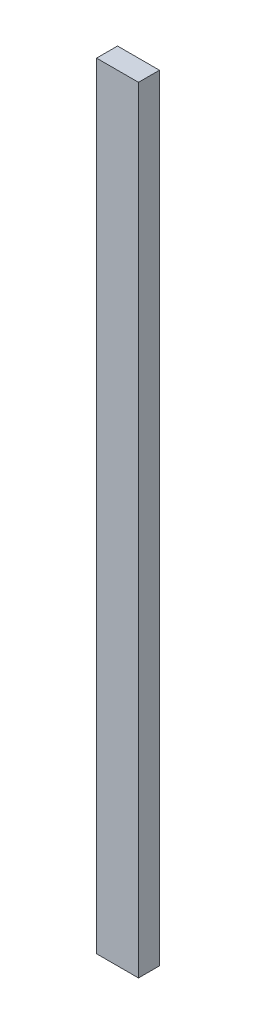
ISO-10303-21;
HEADER;
FILE_DESCRIPTION(('STEP AP214'),'2;1');
FILE_NAME('part.step','',(''),(''),'','','');
FILE_SCHEMA(('AUTOMOTIVE_DESIGN { 1 0 10303 214 1 1 1 1 }'));
ENDSEC;
DATA;
#1=APPLICATION_CONTEXT('core data for automotive mechanical design processes');
#2=APPLICATION_PROTOCOL_DEFINITION('international standard','automotive_design',2000,#1);
#3=PRODUCT_CONTEXT('',#1,'mechanical');
#4=PRODUCT('Part','Part','',(#3));
#5=PRODUCT_RELATED_PRODUCT_CATEGORY('part','',(#4));
#6=PRODUCT_DEFINITION_FORMATION('','',#4);
#7=PRODUCT_DEFINITION_CONTEXT('part definition',#1,'design');
#8=PRODUCT_DEFINITION('design','',#6,#7);
#9=PRODUCT_DEFINITION_SHAPE('','',#8);
#10=(LENGTH_UNIT() NAMED_UNIT(*) SI_UNIT(.MILLI.,.METRE.));
#11=(NAMED_UNIT(*) PLANE_ANGLE_UNIT() SI_UNIT($,.RADIAN.));
#12=(NAMED_UNIT(*) SI_UNIT($,.STERADIAN.) SOLID_ANGLE_UNIT());
#13=UNCERTAINTY_MEASURE_WITH_UNIT(LENGTH_MEASURE(1.E-05),#10,'distance_accuracy_value','');
#14=(GEOMETRIC_REPRESENTATION_CONTEXT(3) GLOBAL_UNCERTAINTY_ASSIGNED_CONTEXT((#13)) GLOBAL_UNIT_ASSIGNED_CONTEXT((#10,
#11,#12)) REPRESENTATION_CONTEXT('',''));
#15=CARTESIAN_POINT('',(0.,0.,0.));
#16=DIRECTION('',(0.,0.,1.));
#17=DIRECTION('',(1.,0.,0.));
#18=AXIS2_PLACEMENT_3D('',#15,#16,#17);
#19=CARTESIAN_POINT('',(0.,-370.,10.));
#20=DIRECTION('',(1.,0.,0.));
#21=DIRECTION('',(0.,1.,0.));
#22=AXIS2_PLACEMENT_3D('',#19,#20,#21);
#23=PLANE('',#22);
#24=DIRECTION('',(0.,-1.,0.));
#25=VECTOR('',#24,1.);
#26=CARTESIAN_POINT('',(0.,-370.,0.));
#27=LINE('',#26,#25);
#28=CARTESIAN_POINT('',(0.,0.,0.));
#29=VERTEX_POINT('',#28);
#30=CARTESIAN_POINT('',(0.,-370.,0.));
#31=VERTEX_POINT('',#30);
#32=EDGE_CURVE('E107',#29,#31,#27,.T.);
#33=ORIENTED_EDGE('',*,*,#32,.T.);
#34=DIRECTION('',(0.,0.,-1.));
#35=VECTOR('',#34,1.);
#36=CARTESIAN_POINT('',(0.,-370.,10.));
#37=LINE('',#36,#35);
#38=CARTESIAN_POINT('',(0.,-370.,10.));
#39=VERTEX_POINT('',#38);
#40=EDGE_CURVE('E11',#39,#31,#37,.T.);
#41=ORIENTED_EDGE('',*,*,#40,.F.);
#42=DIRECTION('',(0.,-1.,0.));
#43=VECTOR('',#42,1.);
#44=CARTESIAN_POINT('',(0.,-370.,10.));
#45=LINE('',#44,#43);
#46=CARTESIAN_POINT('',(0.,0.,10.));
#47=VERTEX_POINT('',#46);
#48=EDGE_CURVE('E91',#47,#39,#45,.T.);
#49=ORIENTED_EDGE('',*,*,#48,.F.);
#50=DIRECTION('',(0.,0.,-1.));
#51=VECTOR('',#50,1.);
#52=CARTESIAN_POINT('',(0.,0.,10.));
#53=LINE('',#52,#51);
#54=EDGE_CURVE('E103',#47,#29,#53,.T.);
#55=ORIENTED_EDGE('',*,*,#54,.T.);
#56=EDGE_LOOP('',(#33,#41,#49,#55));
#57=FACE_BOUND('',#56,.T.);
#58=ADVANCED_FACE('F39',(#57),#23,.F.);
#59=CARTESIAN_POINT('',(20.,-370.,10.));
#60=DIRECTION('',(0.,1.,0.));
#61=DIRECTION('',(0.,0.,1.));
#62=AXIS2_PLACEMENT_3D('',#59,#60,#61);
#63=PLANE('',#62);
#64=DIRECTION('',(1.,0.,0.));
#65=VECTOR('',#64,1.);
#66=CARTESIAN_POINT('',(20.,-370.,0.));
#67=LINE('',#66,#65);
#68=CARTESIAN_POINT('',(20.,-370.,0.));
#69=VERTEX_POINT('',#68);
#70=EDGE_CURVE('E96',#31,#69,#67,.T.);
#71=ORIENTED_EDGE('',*,*,#70,.T.);
#72=DIRECTION('',(0.,0.,-1.));
#73=VECTOR('',#72,1.);
#74=CARTESIAN_POINT('',(20.,-370.,10.));
#75=LINE('',#74,#73);
#76=CARTESIAN_POINT('',(20.,-370.,10.));
#77=VERTEX_POINT('',#76);
#78=EDGE_CURVE('E48',#77,#69,#75,.T.);
#79=ORIENTED_EDGE('',*,*,#78,.F.);
#80=DIRECTION('',(1.,0.,0.));
#81=VECTOR('',#80,1.);
#82=CARTESIAN_POINT('',(20.,-370.,10.));
#83=LINE('',#82,#81);
#84=EDGE_CURVE('E86',#39,#77,#83,.T.);
#85=ORIENTED_EDGE('',*,*,#84,.F.);
#86=ORIENTED_EDGE('',*,*,#40,.T.);
#87=EDGE_LOOP('',(#71,#79,#85,#86));
#88=FACE_BOUND('',#87,.T.);
#89=ADVANCED_FACE('F95',(#88),#63,.F.);
#90=CARTESIAN_POINT('',(20.,0.,10.));
#91=DIRECTION('',(-1.,0.,0.));
#92=DIRECTION('',(0.,-1.,0.));
#93=AXIS2_PLACEMENT_3D('',#90,#91,#92);
#94=PLANE('',#93);
#95=DIRECTION('',(0.,1.,0.));
#96=VECTOR('',#95,1.);
#97=CARTESIAN_POINT('',(20.,0.,0.));
#98=LINE('',#97,#96);
#99=CARTESIAN_POINT('',(20.,0.,0.));
#100=VERTEX_POINT('',#99);
#101=EDGE_CURVE('E73',#69,#100,#98,.T.);
#102=ORIENTED_EDGE('',*,*,#101,.T.);
#103=DIRECTION('',(0.,0.,-1.));
#104=VECTOR('',#103,1.);
#105=CARTESIAN_POINT('',(20.,0.,10.));
#106=LINE('',#105,#104);
#107=CARTESIAN_POINT('',(20.,0.,10.));
#108=VERTEX_POINT('',#107);
#109=EDGE_CURVE('E98',#108,#100,#106,.T.);
#110=ORIENTED_EDGE('',*,*,#109,.F.);
#111=DIRECTION('',(0.,1.,0.));
#112=VECTOR('',#111,1.);
#113=CARTESIAN_POINT('',(20.,0.,10.));
#114=LINE('',#113,#112);
#115=EDGE_CURVE('E89',#77,#108,#114,.T.);
#116=ORIENTED_EDGE('',*,*,#115,.F.);
#117=ORIENTED_EDGE('',*,*,#78,.T.);
#118=EDGE_LOOP('',(#102,#110,#116,#117));
#119=FACE_BOUND('',#118,.T.);
#120=ADVANCED_FACE('F99',(#119),#94,.F.);
#121=CARTESIAN_POINT('',(0.,0.,10.));
#122=DIRECTION('',(0.,-1.,0.));
#123=DIRECTION('',(0.,0.,-1.));
#124=AXIS2_PLACEMENT_3D('',#121,#122,#123);
#125=PLANE('',#124);
#126=DIRECTION('',(-1.,0.,0.));
#127=VECTOR('',#126,1.);
#128=CARTESIAN_POINT('',(0.,0.,0.));
#129=LINE('',#128,#127);
#130=EDGE_CURVE('E79',#100,#29,#129,.T.);
#131=ORIENTED_EDGE('',*,*,#130,.T.);
#132=ORIENTED_EDGE('',*,*,#54,.F.);
#133=DIRECTION('',(-1.,0.,0.));
#134=VECTOR('',#133,1.);
#135=CARTESIAN_POINT('',(0.,0.,10.));
#136=LINE('',#135,#134);
#137=EDGE_CURVE('E56',#108,#47,#136,.T.);
#138=ORIENTED_EDGE('',*,*,#137,.F.);
#139=ORIENTED_EDGE('',*,*,#109,.T.);
#140=EDGE_LOOP('',(#131,#132,#138,#139));
#141=FACE_BOUND('',#140,.T.);
#142=ADVANCED_FACE('F120',(#141),#125,.F.);
#143=CARTESIAN_POINT('',(0.,0.,10.));
#144=DIRECTION('',(0.,0.,-1.));
#145=DIRECTION('',(-1.,0.,0.));
#146=AXIS2_PLACEMENT_3D('',#143,#144,#145);
#147=PLANE('',#146);
#148=ORIENTED_EDGE('',*,*,#48,.T.);
#149=ORIENTED_EDGE('',*,*,#84,.T.);
#150=ORIENTED_EDGE('',*,*,#115,.T.);
#151=ORIENTED_EDGE('',*,*,#137,.T.);
#152=EDGE_LOOP('',(#148,#149,#150,#151));
#153=FACE_BOUND('',#152,.T.);
#154=ADVANCED_FACE('F87',(#153),#147,.F.);
#155=CARTESIAN_POINT('',(0.,0.,0.));
#156=DIRECTION('',(0.,0.,-1.));
#157=DIRECTION('',(-1.,0.,0.));
#158=AXIS2_PLACEMENT_3D('',#155,#156,#157);
#159=PLANE('',#158);
#160=ORIENTED_EDGE('',*,*,#32,.F.);
#161=ORIENTED_EDGE('',*,*,#130,.F.);
#162=ORIENTED_EDGE('',*,*,#101,.F.);
#163=ORIENTED_EDGE('',*,*,#70,.F.);
#164=EDGE_LOOP('',(#160,#161,#162,#163));
#165=FACE_BOUND('',#164,.T.);
#166=ADVANCED_FACE('F123',(#165),#159,.T.);
#167=CLOSED_SHELL('',(#58,#89,#120,#142,#154,#166));
#168=MANIFOLD_SOLID_BREP('B2',#167);
#169=ADVANCED_BREP_SHAPE_REPRESENTATION('',(#18,#168),#14);
#170=SHAPE_DEFINITION_REPRESENTATION(#9,#169);
ENDSEC;
END-ISO-10303-21;
